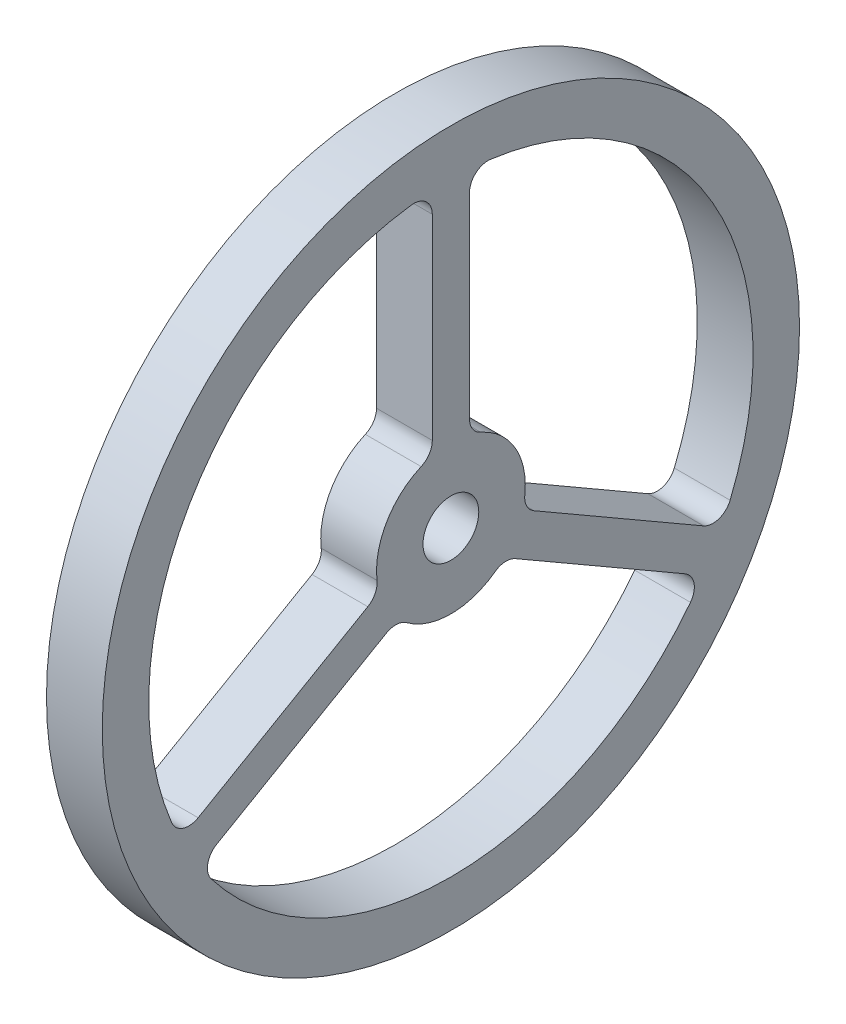
ISO-10303-21;
HEADER;
FILE_DESCRIPTION(('STEP AP214'),'2;1');
FILE_NAME('part.step','',(''),(''),'','','');
FILE_SCHEMA(('AUTOMOTIVE_DESIGN { 1 0 10303 214 1 1 1 1 }'));
ENDSEC;
DATA;
#1=APPLICATION_CONTEXT('core data for automotive mechanical design processes');
#2=APPLICATION_PROTOCOL_DEFINITION('international standard','automotive_design',2000,#1);
#3=PRODUCT_CONTEXT('',#1,'mechanical');
#4=PRODUCT('Part','Part','',(#3));
#5=PRODUCT_RELATED_PRODUCT_CATEGORY('part','',(#4));
#6=PRODUCT_DEFINITION_FORMATION('','',#4);
#7=PRODUCT_DEFINITION_CONTEXT('part definition',#1,'design');
#8=PRODUCT_DEFINITION('design','',#6,#7);
#9=PRODUCT_DEFINITION_SHAPE('','',#8);
#10=(LENGTH_UNIT() NAMED_UNIT(*) SI_UNIT(.MILLI.,.METRE.));
#11=(NAMED_UNIT(*) PLANE_ANGLE_UNIT() SI_UNIT($,.RADIAN.));
#12=(NAMED_UNIT(*) SI_UNIT($,.STERADIAN.) SOLID_ANGLE_UNIT());
#13=UNCERTAINTY_MEASURE_WITH_UNIT(LENGTH_MEASURE(1.E-05),#10,'distance_accuracy_value','');
#14=(GEOMETRIC_REPRESENTATION_CONTEXT(3) GLOBAL_UNCERTAINTY_ASSIGNED_CONTEXT((#13)) GLOBAL_UNIT_ASSIGNED_CONTEXT((#10,
#11,#12)) REPRESENTATION_CONTEXT('',''));
#15=CARTESIAN_POINT('',(0.,0.,0.));
#16=DIRECTION('',(0.,0.,1.));
#17=DIRECTION('',(1.,0.,0.));
#18=AXIS2_PLACEMENT_3D('',#15,#16,#17);
#19=CARTESIAN_POINT('',(6.,0.,2.));
#20=DIRECTION('',(0.,0.,-1.));
#21=DIRECTION('',(0.,1.,0.));
#22=AXIS2_PLACEMENT_3D('',#19,#20,#21);
#23=PLANE('',#22);
#24=DIRECTION('',(0.,-1.,0.));
#25=VECTOR('',#24,1.);
#26=CARTESIAN_POINT('',(0.,0.,2.));
#27=LINE('',#26,#25);
#28=CARTESIAN_POINT('',(0.,30.2365672654817,2.));
#29=VERTEX_POINT('',#28);
#30=CARTESIAN_POINT('',(0.,9.16515138991168,2.));
#31=VERTEX_POINT('',#30);
#32=EDGE_CURVE('E226',#29,#31,#27,.T.);
#33=ORIENTED_EDGE('',*,*,#32,.T.);
#34=DIRECTION('',(1.,0.,0.));
#35=VECTOR('',#34,1.);
#36=CARTESIAN_POINT('',(6.,9.16515138991168,2.));
#37=LINE('',#36,#35);
#38=CARTESIAN_POINT('',(6.,9.16515138991168,2.));
#39=VERTEX_POINT('',#38);
#40=EDGE_CURVE('E202',#31,#39,#37,.T.);
#41=ORIENTED_EDGE('',*,*,#40,.T.);
#42=DIRECTION('',(0.,-1.,0.));
#43=VECTOR('',#42,1.);
#44=CARTESIAN_POINT('',(6.,0.,2.));
#45=LINE('',#44,#43);
#46=CARTESIAN_POINT('',(6.,30.2365672654817,2.));
#47=VERTEX_POINT('',#46);
#48=EDGE_CURVE('E364',#47,#39,#45,.T.);
#49=ORIENTED_EDGE('',*,*,#48,.F.);
#50=DIRECTION('',(-1.,0.,0.));
#51=VECTOR('',#50,1.);
#52=CARTESIAN_POINT('',(6.,30.2365672654817,2.));
#53=LINE('',#52,#51);
#54=EDGE_CURVE('E218',#47,#29,#53,.T.);
#55=ORIENTED_EDGE('',*,*,#54,.T.);
#56=EDGE_LOOP('',(#33,#41,#49,#55));
#57=FACE_BOUND('',#56,.T.);
#58=ADVANCED_FACE('F35',(#57),#23,.F.);
#59=CARTESIAN_POINT('',(6.,0.,0.));
#60=DIRECTION('',(-1.,0.,0.));
#61=DIRECTION('',(0.,0.,1.));
#62=AXIS2_PLACEMENT_3D('',#59,#60,#61);
#63=CYLINDRICAL_SURFACE('',#62,8.);
#64=CARTESIAN_POINT('',(6.,0.,0.));
#65=DIRECTION('',(1.,0.,0.));
#66=DIRECTION('',(0.,0.,-1.));
#67=AXIS2_PLACEMENT_3D('',#64,#65,#66);
#68=CIRCLE('',#67,8.);
#69=CARTESIAN_POINT('',(6.,7.33212111192934,3.2));
#70=VERTEX_POINT('',#69);
#71=CARTESIAN_POINT('',(6.,-0.894779263856105,7.94980314655483));
#72=VERTEX_POINT('',#71);
#73=EDGE_CURVE('E217',#70,#72,#68,.T.);
#74=ORIENTED_EDGE('',*,*,#73,.F.);
#75=DIRECTION('',(-1.,0.,0.));
#76=VECTOR('',#75,1.);
#77=CARTESIAN_POINT('',(6.,7.33212111192935,3.2));
#78=LINE('',#77,#76);
#79=CARTESIAN_POINT('',(0.,7.33212111192934,3.2));
#80=VERTEX_POINT('',#79);
#81=EDGE_CURVE('E201',#70,#80,#78,.T.);
#82=ORIENTED_EDGE('',*,*,#81,.T.);
#83=CARTESIAN_POINT('',(0.,0.,0.));
#84=DIRECTION('',(1.,0.,0.));
#85=DIRECTION('',(0.,0.,-1.));
#86=AXIS2_PLACEMENT_3D('',#83,#84,#85);
#87=CIRCLE('',#86,8.);
#88=CARTESIAN_POINT('',(0.,-0.894779263856105,7.94980314655483));
#89=VERTEX_POINT('',#88);
#90=EDGE_CURVE('E214',#80,#89,#87,.T.);
#91=ORIENTED_EDGE('',*,*,#90,.T.);
#92=DIRECTION('',(-1.,0.,0.));
#93=VECTOR('',#92,1.);
#94=CARTESIAN_POINT('',(6.,-0.894779263856105,7.94980314655483));
#95=LINE('',#94,#93);
#96=EDGE_CURVE('E219',#89,#72,#95,.F.);
#97=ORIENTED_EDGE('',*,*,#96,.T.);
#98=EDGE_LOOP('',(#74,#82,#91,#97));
#99=FACE_BOUND('',#98,.T.);
#100=ADVANCED_FACE('F213',(#99),#63,.T.);
#101=CARTESIAN_POINT('',(6.,1.73205080756725,0.99999999999906));
#102=DIRECTION('',(0.,0.866025403784438,0.5));
#103=DIRECTION('',(0.,-0.5,0.866025403784439));
#104=AXIS2_PLACEMENT_3D('',#101,#102,#103);
#105=PLANE('',#104);
#106=DIRECTION('',(0.,0.5,-0.866025403784438));
#107=VECTOR('',#106,1.);
#108=CARTESIAN_POINT('',(6.,1.73205080756725,0.99999999999906));
#109=LINE('',#108,#107);
#110=CARTESIAN_POINT('',(6.,-13.3862328251737,27.1856353751434));
#111=VERTEX_POINT('',#110);
#112=CARTESIAN_POINT('',(6.,-2.85052488738901,8.93725393319354));
#113=VERTEX_POINT('',#112);
#114=EDGE_CURVE('E369',#111,#113,#109,.T.);
#115=ORIENTED_EDGE('',*,*,#114,.T.);
#116=DIRECTION('',(-1.,0.,0.));
#117=VECTOR('',#116,1.);
#118=CARTESIAN_POINT('',(6.,-2.85052488738901,8.93725393319354));
#119=LINE('',#118,#117);
#120=CARTESIAN_POINT('',(0.,-2.85052488738901,8.93725393319354));
#121=VERTEX_POINT('',#120);
#122=EDGE_CURVE('E272',#113,#121,#119,.T.);
#123=ORIENTED_EDGE('',*,*,#122,.T.);
#124=DIRECTION('',(0.,0.5,-0.866025403784438));
#125=VECTOR('',#124,1.);
#126=CARTESIAN_POINT('',(0.,1.73205080756725,0.99999999999906));
#127=LINE('',#126,#125);
#128=CARTESIAN_POINT('',(0.,-13.3862328251737,27.1856353751434));
#129=VERTEX_POINT('',#128);
#130=EDGE_CURVE('E225',#129,#121,#127,.T.);
#131=ORIENTED_EDGE('',*,*,#130,.F.);
#132=DIRECTION('',(1.,0.,0.));
#133=VECTOR('',#132,1.);
#134=CARTESIAN_POINT('',(6.,-13.3862328251737,27.1856353751434));
#135=LINE('',#134,#133);
#136=EDGE_CURVE('E270',#129,#111,#135,.T.);
#137=ORIENTED_EDGE('',*,*,#136,.T.);
#138=EDGE_LOOP('',(#115,#123,#131,#137));
#139=FACE_BOUND('',#138,.T.);
#140=ADVANCED_FACE('F427',(#139),#105,.T.);
#141=CARTESIAN_POINT('',(6.,-1.7320508075705,-1.00000000000094));
#142=DIRECTION('',(0.,0.866025403784438,0.500000000000001));
#143=DIRECTION('',(0.,-0.500000000000001,0.866025403784438));
#144=AXIS2_PLACEMENT_3D('',#141,#142,#143);
#145=PLANE('',#144);
#146=DIRECTION('',(0.,0.5,-0.866025403784438));
#147=VECTOR('',#146,1.);
#148=CARTESIAN_POINT('',(0.,-1.7320508075705,-1.00000000000094));
#149=LINE('',#148,#147);
#150=CARTESIAN_POINT('',(0.,-16.8503344403113,25.185635375143));
#151=VERTEX_POINT('',#150);
#152=CARTESIAN_POINT('',(0.,-6.31462650252594,6.93725393319212));
#153=VERTEX_POINT('',#152);
#154=EDGE_CURVE('E241',#151,#153,#149,.T.);
#155=ORIENTED_EDGE('',*,*,#154,.T.);
#156=DIRECTION('',(1.,0.,0.));
#157=VECTOR('',#156,1.);
#158=CARTESIAN_POINT('',(6.,-6.31462650252594,6.93725393319212));
#159=LINE('',#158,#157);
#160=CARTESIAN_POINT('',(6.,-6.31462650252594,6.93725393319212));
#161=VERTEX_POINT('',#160);
#162=EDGE_CURVE('E281',#153,#161,#159,.T.);
#163=ORIENTED_EDGE('',*,*,#162,.T.);
#164=DIRECTION('',(0.,0.5,-0.866025403784438));
#165=VECTOR('',#164,1.);
#166=CARTESIAN_POINT('',(6.,-1.7320508075705,-1.00000000000094));
#167=LINE('',#166,#165);
#168=CARTESIAN_POINT('',(6.,-16.8503344403113,25.185635375143));
#169=VERTEX_POINT('',#168);
#170=EDGE_CURVE('E414',#169,#161,#167,.T.);
#171=ORIENTED_EDGE('',*,*,#170,.F.);
#172=DIRECTION('',(-1.,0.,0.));
#173=VECTOR('',#172,1.);
#174=CARTESIAN_POINT('',(6.,-16.8503344403113,25.185635375143));
#175=LINE('',#174,#173);
#176=EDGE_CURVE('E279',#169,#151,#175,.T.);
#177=ORIENTED_EDGE('',*,*,#176,.T.);
#178=EDGE_LOOP('',(#155,#163,#171,#177));
#179=FACE_BOUND('',#178,.T.);
#180=ADVANCED_FACE('F456',(#179),#145,.F.);
#181=CARTESIAN_POINT('',(6.,-6.43734184807585,4.7498031465537));
#182=VERTEX_POINT('',#181);
#183=CARTESIAN_POINT('',(6.,-6.43734184807336,-4.74980314655707));
#184=VERTEX_POINT('',#183);
#185=EDGE_CURVE('E372',#182,#184,#68,.T.);
#186=ORIENTED_EDGE('',*,*,#185,.F.);
#187=DIRECTION('',(-1.,0.,0.));
#188=VECTOR('',#187,1.);
#189=CARTESIAN_POINT('',(6.,-6.43734184807585,4.7498031465537));
#190=LINE('',#189,#188);
#191=CARTESIAN_POINT('',(0.,-6.43734184807585,4.7498031465537));
#192=VERTEX_POINT('',#191);
#193=EDGE_CURVE('E277',#182,#192,#190,.T.);
#194=ORIENTED_EDGE('',*,*,#193,.T.);
#195=CARTESIAN_POINT('',(0.,-6.43734184807336,-4.74980314655707));
#196=VERTEX_POINT('',#195);
#197=EDGE_CURVE('E229',#192,#196,#87,.T.);
#198=ORIENTED_EDGE('',*,*,#197,.T.);
#199=DIRECTION('',(-1.,0.,0.));
#200=VECTOR('',#199,1.);
#201=CARTESIAN_POINT('',(6.,-6.43734184807336,-4.74980314655707));
#202=LINE('',#201,#200);
#203=EDGE_CURVE('E275',#196,#184,#202,.F.);
#204=ORIENTED_EDGE('',*,*,#203,.T.);
#205=EDGE_LOOP('',(#186,#194,#198,#204));
#206=FACE_BOUND('',#205,.T.);
#207=ADVANCED_FACE('F449',(#206),#63,.T.);
#208=CARTESIAN_POINT('',(6.,-1.73205080756635,0.999999999998538));
#209=DIRECTION('',(0.,-0.866025403784439,0.5));
#210=DIRECTION('',(0.,-0.5,-0.866025403784439));
#211=AXIS2_PLACEMENT_3D('',#208,#209,#210);
#212=PLANE('',#211);
#213=DIRECTION('',(0.,0.5,0.866025403784439));
#214=VECTOR('',#213,1.);
#215=CARTESIAN_POINT('',(6.,-1.73205080756635,0.999999999998538));
#216=LINE('',#215,#214);
#217=CARTESIAN_POINT('',(6.,-16.8503344403074,-25.1856353751459));
#218=VERTEX_POINT('',#217);
#219=CARTESIAN_POINT('',(6.,-6.31462650252282,-6.93725393319634));
#220=VERTEX_POINT('',#219);
#221=EDGE_CURVE('E374',#218,#220,#216,.T.);
#222=ORIENTED_EDGE('',*,*,#221,.T.);
#223=DIRECTION('',(-1.,0.,0.));
#224=VECTOR('',#223,1.);
#225=CARTESIAN_POINT('',(6.,-6.31462650252282,-6.93725393319634));
#226=LINE('',#225,#224);
#227=CARTESIAN_POINT('',(0.,-6.31462650252282,-6.93725393319634));
#228=VERTEX_POINT('',#227);
#229=EDGE_CURVE('E285',#220,#228,#226,.T.);
#230=ORIENTED_EDGE('',*,*,#229,.T.);
#231=DIRECTION('',(0.,0.5,0.866025403784439));
#232=VECTOR('',#231,1.);
#233=CARTESIAN_POINT('',(0.,-1.73205080756635,0.999999999998538));
#234=LINE('',#233,#232);
#235=CARTESIAN_POINT('',(0.,-16.8503344403074,-25.1856353751459));
#236=VERTEX_POINT('',#235);
#237=EDGE_CURVE('E240',#236,#228,#234,.T.);
#238=ORIENTED_EDGE('',*,*,#237,.F.);
#239=DIRECTION('',(1.,0.,0.));
#240=VECTOR('',#239,1.);
#241=CARTESIAN_POINT('',(6.,-16.8503344403074,-25.1856353751459));
#242=LINE('',#241,#240);
#243=EDGE_CURVE('E283',#236,#218,#242,.T.);
#244=ORIENTED_EDGE('',*,*,#243,.T.);
#245=EDGE_LOOP('',(#222,#230,#238,#244));
#246=FACE_BOUND('',#245,.T.);
#247=ADVANCED_FACE('F452',(#246),#212,.T.);
#248=CARTESIAN_POINT('',(6.,1.7320508075714,-1.00000000000145));
#249=DIRECTION('',(0.,-0.866025403784439,0.5));
#250=DIRECTION('',(0.,-0.5,-0.866025403784439));
#251=AXIS2_PLACEMENT_3D('',#248,#249,#250);
#252=PLANE('',#251);
#253=DIRECTION('',(0.,0.5,0.866025403784439));
#254=VECTOR('',#253,1.);
#255=CARTESIAN_POINT('',(0.,1.7320508075714,-1.00000000000145));
#256=LINE('',#255,#254);
#257=CARTESIAN_POINT('',(0.,-13.3862328251693,-27.1856353751453));
#258=VERTEX_POINT('',#257);
#259=CARTESIAN_POINT('',(0.,-2.8505248873838,-8.93725393319413));
#260=VERTEX_POINT('',#259);
#261=EDGE_CURVE('E238',#258,#260,#256,.T.);
#262=ORIENTED_EDGE('',*,*,#261,.T.);
#263=DIRECTION('',(1.,0.,0.));
#264=VECTOR('',#263,1.);
#265=CARTESIAN_POINT('',(6.,-2.8505248873838,-8.93725393319413));
#266=LINE('',#265,#264);
#267=CARTESIAN_POINT('',(6.,-2.8505248873838,-8.93725393319413));
#268=VERTEX_POINT('',#267);
#269=EDGE_CURVE('E296',#260,#268,#266,.T.);
#270=ORIENTED_EDGE('',*,*,#269,.T.);
#271=DIRECTION('',(0.,0.5,0.866025403784439));
#272=VECTOR('',#271,1.);
#273=CARTESIAN_POINT('',(6.,1.7320508075714,-1.00000000000145));
#274=LINE('',#273,#272);
#275=CARTESIAN_POINT('',(6.,-13.3862328251693,-27.1856353751453));
#276=VERTEX_POINT('',#275);
#277=EDGE_CURVE('E264',#276,#268,#274,.T.);
#278=ORIENTED_EDGE('',*,*,#277,.F.);
#279=DIRECTION('',(-1.,0.,0.));
#280=VECTOR('',#279,1.);
#281=CARTESIAN_POINT('',(6.,-13.3862328251693,-27.1856353751453));
#282=LINE('',#281,#280);
#283=EDGE_CURVE('E293',#276,#258,#282,.T.);
#284=ORIENTED_EDGE('',*,*,#283,.T.);
#285=EDGE_LOOP('',(#262,#270,#278,#284));
#286=FACE_BOUND('',#285,.T.);
#287=ADVANCED_FACE('F390',(#286),#252,.F.);
#288=CARTESIAN_POINT('',(6.,-0.894779263851941,-7.9498031465553));
#289=VERTEX_POINT('',#288);
#290=CARTESIAN_POINT('',(6.,7.33212111192934,-3.2));
#291=VERTEX_POINT('',#290);
#292=EDGE_CURVE('E371',#289,#291,#68,.T.);
#293=ORIENTED_EDGE('',*,*,#292,.F.);
#294=DIRECTION('',(-1.,0.,0.));
#295=VECTOR('',#294,1.);
#296=CARTESIAN_POINT('',(6.,-0.894779263851941,-7.9498031465553));
#297=LINE('',#296,#295);
#298=CARTESIAN_POINT('',(0.,-0.894779263851941,-7.9498031465553));
#299=VERTEX_POINT('',#298);
#300=EDGE_CURVE('E290',#289,#299,#297,.T.);
#301=ORIENTED_EDGE('',*,*,#300,.T.);
#302=CARTESIAN_POINT('',(0.,7.33212111192934,-3.2));
#303=VERTEX_POINT('',#302);
#304=EDGE_CURVE('E228',#299,#303,#87,.T.);
#305=ORIENTED_EDGE('',*,*,#304,.T.);
#306=DIRECTION('',(-1.,0.,0.));
#307=VECTOR('',#306,1.);
#308=CARTESIAN_POINT('',(6.,7.33212111192935,-3.2));
#309=LINE('',#308,#307);
#310=EDGE_CURVE('E288',#303,#291,#309,.F.);
#311=ORIENTED_EDGE('',*,*,#310,.T.);
#312=EDGE_LOOP('',(#293,#301,#305,#311));
#313=FACE_BOUND('',#312,.T.);
#314=ADVANCED_FACE('F406',(#313),#63,.T.);
#315=CARTESIAN_POINT('',(6.,0.,-2.));
#316=DIRECTION('',(0.,0.,-1.));
#317=DIRECTION('',(0.,1.,0.));
#318=AXIS2_PLACEMENT_3D('',#315,#316,#317);
#319=PLANE('',#318);
#320=DIRECTION('',(0.,-1.,0.));
#321=VECTOR('',#320,1.);
#322=CARTESIAN_POINT('',(6.,0.,-2.));
#323=LINE('',#322,#321);
#324=CARTESIAN_POINT('',(6.,30.2365672654817,-2.));
#325=VERTEX_POINT('',#324);
#326=CARTESIAN_POINT('',(6.,9.16515138991168,-2.));
#327=VERTEX_POINT('',#326);
#328=EDGE_CURVE('E409',#325,#327,#323,.T.);
#329=ORIENTED_EDGE('',*,*,#328,.T.);
#330=DIRECTION('',(-1.,0.,0.));
#331=VECTOR('',#330,1.);
#332=CARTESIAN_POINT('',(6.,9.16515138991168,-2.));
#333=LINE('',#332,#331);
#334=CARTESIAN_POINT('',(0.,9.16515138991168,-2.));
#335=VERTEX_POINT('',#334);
#336=EDGE_CURVE('E300',#327,#335,#333,.T.);
#337=ORIENTED_EDGE('',*,*,#336,.T.);
#338=DIRECTION('',(0.,-1.,0.));
#339=VECTOR('',#338,1.);
#340=CARTESIAN_POINT('',(0.,0.,-2.));
#341=LINE('',#340,#339);
#342=CARTESIAN_POINT('',(0.,30.2365672654817,-2.));
#343=VERTEX_POINT('',#342);
#344=EDGE_CURVE('E237',#343,#335,#341,.T.);
#345=ORIENTED_EDGE('',*,*,#344,.F.);
#346=DIRECTION('',(1.,0.,0.));
#347=VECTOR('',#346,1.);
#348=CARTESIAN_POINT('',(6.,30.2365672654817,-2.));
#349=LINE('',#348,#347);
#350=EDGE_CURVE('E298',#343,#325,#349,.T.);
#351=ORIENTED_EDGE('',*,*,#350,.T.);
#352=EDGE_LOOP('',(#329,#337,#345,#351));
#353=FACE_BOUND('',#352,.T.);
#354=ADVANCED_FACE('F459',(#353),#319,.T.);
#355=CARTESIAN_POINT('',(6.,0.,0.));
#356=DIRECTION('',(-1.,0.,0.));
#357=DIRECTION('',(0.,0.,1.));
#358=AXIS2_PLACEMENT_3D('',#355,#356,#357);
#359=CYLINDRICAL_SURFACE('',#358,37.5);
#360=CARTESIAN_POINT('',(6.,0.,0.));
#361=DIRECTION('',(1.,0.,0.));
#362=DIRECTION('',(0.,0.,-1.));
#363=AXIS2_PLACEMENT_3D('',#360,#361,#362);
#364=CIRCLE('',#363,37.5);
#365=CARTESIAN_POINT('',(6.,0.,-37.5));
#366=VERTEX_POINT('',#365);
#367=EDGE_CURVE('E382',#366,#366,#364,.T.);
#368=ORIENTED_EDGE('',*,*,#367,.F.);
#369=EDGE_LOOP('',(#368));
#370=FACE_BOUND('',#369,.T.);
#371=CARTESIAN_POINT('',(0.,0.,0.));
#372=DIRECTION('',(1.,0.,0.));
#373=DIRECTION('',(0.,0.,-1.));
#374=AXIS2_PLACEMENT_3D('',#371,#372,#373);
#375=CIRCLE('',#374,37.5);
#376=CARTESIAN_POINT('',(0.,0.,-37.5));
#377=VERTEX_POINT('',#376);
#378=EDGE_CURVE('E258',#377,#377,#375,.T.);
#379=ORIENTED_EDGE('',*,*,#378,.T.);
#380=EDGE_LOOP('',(#379));
#381=FACE_BOUND('',#380,.T.);
#382=ADVANCED_FACE('F462',(#370,#381),#359,.T.);
#383=CARTESIAN_POINT('',(6.,0.,0.));
#384=DIRECTION('',(-1.,0.,0.));
#385=DIRECTION('',(0.,0.,1.));
#386=AXIS2_PLACEMENT_3D('',#383,#384,#385);
#387=CYLINDRICAL_SURFACE('',#386,32.5);
#388=CARTESIAN_POINT('',(6.,0.,0.));
#389=DIRECTION('',(1.,0.,0.));
#390=DIRECTION('',(0.,0.,-1.));
#391=AXIS2_PLACEMENT_3D('',#388,#389,#390);
#392=CIRCLE('',#391,32.5);
#393=CARTESIAN_POINT('',(6.,32.2192929878084,4.26229508196721));
#394=VERTEX_POINT('',#393);
#395=CARTESIAN_POINT('',(6.,-12.418390674497,30.0338737603987));
#396=VERTEX_POINT('',#395);
#397=EDGE_CURVE('E365',#394,#396,#392,.T.);
#398=ORIENTED_EDGE('',*,*,#397,.T.);
#399=DIRECTION('',(-1.,0.,0.));
#400=VECTOR('',#399,1.);
#401=CARTESIAN_POINT('',(6.,-12.418390674497,30.0338737603987));
#402=LINE('',#401,#400);
#403=CARTESIAN_POINT('',(0.,-12.418390674497,30.0338737603987));
#404=VERTEX_POINT('',#403);
#405=EDGE_CURVE('E208',#396,#404,#402,.T.);
#406=ORIENTED_EDGE('',*,*,#405,.T.);
#407=CARTESIAN_POINT('',(0.,0.,0.));
#408=DIRECTION('',(1.,0.,0.));
#409=DIRECTION('',(0.,0.,-1.));
#410=AXIS2_PLACEMENT_3D('',#407,#408,#409);
#411=CIRCLE('',#410,32.5);
#412=CARTESIAN_POINT('',(0.,32.2192929878084,4.26229508196721));
#413=VERTEX_POINT('',#412);
#414=EDGE_CURVE('E230',#413,#404,#411,.T.);
#415=ORIENTED_EDGE('',*,*,#414,.F.);
#416=DIRECTION('',(-1.,0.,0.));
#417=VECTOR('',#416,1.);
#418=CARTESIAN_POINT('',(6.,32.2192929878084,4.26229508196721));
#419=LINE('',#418,#417);
#420=EDGE_CURVE('E57',#413,#394,#419,.F.);
#421=ORIENTED_EDGE('',*,*,#420,.T.);
#422=EDGE_LOOP('',(#398,#406,#415,#421));
#423=FACE_BOUND('',#422,.T.);
#424=ADVANCED_FACE('F357',(#423),#387,.F.);
#425=CARTESIAN_POINT('',(6.,-19.8009023133149,25.771578678431));
#426=VERTEX_POINT('',#425);
#427=CARTESIAN_POINT('',(6.,-19.8009023133108,-25.7715786784342));
#428=VERTEX_POINT('',#427);
#429=EDGE_CURVE('E367',#426,#428,#392,.T.);
#430=ORIENTED_EDGE('',*,*,#429,.T.);
#431=DIRECTION('',(-1.,0.,0.));
#432=VECTOR('',#431,1.);
#433=CARTESIAN_POINT('',(6.,-19.8009023133108,-25.7715786784342));
#434=LINE('',#433,#432);
#435=CARTESIAN_POINT('',(0.,-19.8009023133108,-25.7715786784342));
#436=VERTEX_POINT('',#435);
#437=EDGE_CURVE('E305',#428,#436,#434,.T.);
#438=ORIENTED_EDGE('',*,*,#437,.T.);
#439=CARTESIAN_POINT('',(0.,-19.8009023133149,25.771578678431));
#440=VERTEX_POINT('',#439);
#441=EDGE_CURVE('E232',#440,#436,#411,.T.);
#442=ORIENTED_EDGE('',*,*,#441,.F.);
#443=DIRECTION('',(-1.,0.,0.));
#444=VECTOR('',#443,1.);
#445=CARTESIAN_POINT('',(6.,-19.8009023133149,25.771578678431));
#446=LINE('',#445,#444);
#447=EDGE_CURVE('E303',#440,#426,#446,.F.);
#448=ORIENTED_EDGE('',*,*,#447,.T.);
#449=EDGE_LOOP('',(#430,#438,#442,#448));
#450=FACE_BOUND('',#449,.T.);
#451=ADVANCED_FACE('F488',(#450),#387,.F.);
#452=CARTESIAN_POINT('',(0.,-12.4183906744922,-30.0338737604007));
#453=VERTEX_POINT('',#452);
#454=CARTESIAN_POINT('',(0.,32.2192929878084,-4.26229508196721));
#455=VERTEX_POINT('',#454);
#456=EDGE_CURVE('E249',#453,#455,#411,.T.);
#457=ORIENTED_EDGE('',*,*,#456,.F.);
#458=DIRECTION('',(-1.,0.,0.));
#459=VECTOR('',#458,1.);
#460=CARTESIAN_POINT('',(6.,-12.4183906744922,-30.0338737604007));
#461=LINE('',#460,#459);
#462=CARTESIAN_POINT('',(6.,-12.4183906744922,-30.0338737604007));
#463=VERTEX_POINT('',#462);
#464=EDGE_CURVE('E311',#453,#463,#461,.F.);
#465=ORIENTED_EDGE('',*,*,#464,.T.);
#466=CARTESIAN_POINT('',(6.,32.2192929878084,-4.26229508196721));
#467=VERTEX_POINT('',#466);
#468=EDGE_CURVE('E376',#463,#467,#392,.T.);
#469=ORIENTED_EDGE('',*,*,#468,.T.);
#470=DIRECTION('',(-1.,0.,0.));
#471=VECTOR('',#470,1.);
#472=CARTESIAN_POINT('',(6.,32.2192929878084,-4.26229508196721));
#473=LINE('',#472,#471);
#474=EDGE_CURVE('E308',#467,#455,#473,.T.);
#475=ORIENTED_EDGE('',*,*,#474,.T.);
#476=EDGE_LOOP('',(#457,#465,#469,#475));
#477=FACE_BOUND('',#476,.T.);
#478=ADVANCED_FACE('F518',(#477),#387,.F.);
#479=CARTESIAN_POINT('',(6.,0.,0.));
#480=DIRECTION('',(-1.,0.,0.));
#481=DIRECTION('',(0.,0.,1.));
#482=AXIS2_PLACEMENT_3D('',#479,#480,#481);
#483=CYLINDRICAL_SURFACE('',#482,3.);
#484=CARTESIAN_POINT('',(6.,0.,0.));
#485=DIRECTION('',(1.,0.,0.));
#486=DIRECTION('',(0.,0.,-1.));
#487=AXIS2_PLACEMENT_3D('',#484,#485,#486);
#488=CIRCLE('',#487,3.);
#489=CARTESIAN_POINT('',(6.,0.,-3.));
#490=VERTEX_POINT('',#489);
#491=EDGE_CURVE('E265',#490,#490,#488,.T.);
#492=ORIENTED_EDGE('',*,*,#491,.T.);
#493=EDGE_LOOP('',(#492));
#494=FACE_BOUND('',#493,.T.);
#495=CARTESIAN_POINT('',(0.,0.,0.));
#496=DIRECTION('',(1.,0.,0.));
#497=DIRECTION('',(0.,0.,-1.));
#498=AXIS2_PLACEMENT_3D('',#495,#496,#497);
#499=CIRCLE('',#498,3.);
#500=CARTESIAN_POINT('',(0.,0.,-3.));
#501=VERTEX_POINT('',#500);
#502=EDGE_CURVE('E261',#501,#501,#499,.T.);
#503=ORIENTED_EDGE('',*,*,#502,.F.);
#504=EDGE_LOOP('',(#503));
#505=FACE_BOUND('',#504,.T.);
#506=ADVANCED_FACE('F614',(#494,#505),#483,.F.);
#507=CARTESIAN_POINT('',(6.,0.,0.));
#508=DIRECTION('',(1.,0.,0.));
#509=DIRECTION('',(0.,0.,-1.));
#510=AXIS2_PLACEMENT_3D('',#507,#508,#509);
#511=PLANE('',#510);
#512=ORIENTED_EDGE('',*,*,#468,.F.);
#513=CARTESIAN_POINT('',(6.,-11.6541820176004,-28.1856353751453));
#514=DIRECTION('',(1.,0.,0.));
#515=DIRECTION('',(0.,0.,-1.));
#516=AXIS2_PLACEMENT_3D('',#513,#514,#515);
#517=CIRCLE('',#516,2.);
#518=EDGE_CURVE('E342',#463,#276,#517,.F.);
#519=ORIENTED_EDGE('',*,*,#518,.T.);
#520=ORIENTED_EDGE('',*,*,#277,.T.);
#521=CARTESIAN_POINT('',(6.,-1.11847407981493,-9.93725393319413));
#522=DIRECTION('',(1.,0.,0.));
#523=DIRECTION('',(0.,0.,-1.));
#524=AXIS2_PLACEMENT_3D('',#521,#522,#523);
#525=CIRCLE('',#524,2.);
#526=EDGE_CURVE('E330',#268,#289,#525,.F.);
#527=ORIENTED_EDGE('',*,*,#526,.T.);
#528=ORIENTED_EDGE('',*,*,#292,.T.);
#529=CARTESIAN_POINT('',(6.,9.16515138991168,-4.));
#530=DIRECTION('',(1.,0.,0.));
#531=DIRECTION('',(0.,0.,-1.));
#532=AXIS2_PLACEMENT_3D('',#529,#530,#531);
#533=CIRCLE('',#532,2.);
#534=EDGE_CURVE('E334',#291,#327,#533,.F.);
#535=ORIENTED_EDGE('',*,*,#534,.T.);
#536=ORIENTED_EDGE('',*,*,#328,.F.);
#537=CARTESIAN_POINT('',(6.,30.2365672654817,-4.));
#538=DIRECTION('',(1.,0.,0.));
#539=DIRECTION('',(0.,0.,-1.));
#540=AXIS2_PLACEMENT_3D('',#537,#538,#539);
#541=CIRCLE('',#540,2.);
#542=EDGE_CURVE('E353',#325,#467,#541,.F.);
#543=ORIENTED_EDGE('',*,*,#542,.T.);
#544=EDGE_LOOP('',(#512,#519,#520,#527,#528,#535,#536,#543));
#545=FACE_BOUND('',#544,.T.);
#546=ORIENTED_EDGE('',*,*,#429,.F.);
#547=CARTESIAN_POINT('',(6.,-18.5823852478801,24.185635375143));
#548=DIRECTION('',(1.,0.,0.));
#549=DIRECTION('',(0.,0.,-1.));
#550=AXIS2_PLACEMENT_3D('',#547,#548,#549);
#551=CIRCLE('',#550,2.);
#552=EDGE_CURVE('E346',#426,#169,#551,.F.);
#553=ORIENTED_EDGE('',*,*,#552,.T.);
#554=ORIENTED_EDGE('',*,*,#170,.T.);
#555=CARTESIAN_POINT('',(6.,-8.04667731009481,5.93725393319212));
#556=DIRECTION('',(1.,0.,0.));
#557=DIRECTION('',(0.,0.,-1.));
#558=AXIS2_PLACEMENT_3D('',#555,#556,#557);
#559=CIRCLE('',#558,2.);
#560=EDGE_CURVE('E322',#161,#182,#559,.F.);
#561=ORIENTED_EDGE('',*,*,#560,.T.);
#562=ORIENTED_EDGE('',*,*,#185,.T.);
#563=CARTESIAN_POINT('',(6.,-8.0466773100917,-5.93725393319634));
#564=DIRECTION('',(1.,0.,0.));
#565=DIRECTION('',(0.,0.,-1.));
#566=AXIS2_PLACEMENT_3D('',#563,#564,#565);
#567=CIRCLE('',#566,2.);
#568=EDGE_CURVE('E326',#184,#220,#567,.F.);
#569=ORIENTED_EDGE('',*,*,#568,.T.);
#570=ORIENTED_EDGE('',*,*,#221,.F.);
#571=CARTESIAN_POINT('',(6.,-18.5823852478763,-24.1856353751459));
#572=DIRECTION('',(1.,0.,0.));
#573=DIRECTION('',(0.,0.,-1.));
#574=AXIS2_PLACEMENT_3D('',#571,#572,#573);
#575=CIRCLE('',#574,2.);
#576=EDGE_CURVE('E338',#218,#428,#575,.F.);
#577=ORIENTED_EDGE('',*,*,#576,.T.);
#578=EDGE_LOOP('',(#546,#553,#554,#561,#562,#569,#570,#577));
#579=FACE_BOUND('',#578,.T.);
#580=ORIENTED_EDGE('',*,*,#397,.F.);
#581=CARTESIAN_POINT('',(6.,30.2365672654817,4.));
#582=DIRECTION('',(1.,0.,0.));
#583=DIRECTION('',(0.,0.,-1.));
#584=AXIS2_PLACEMENT_3D('',#581,#582,#583);
#585=CIRCLE('',#584,2.);
#586=EDGE_CURVE('E11',#394,#47,#585,.F.);
#587=ORIENTED_EDGE('',*,*,#586,.T.);
#588=ORIENTED_EDGE('',*,*,#48,.T.);
#589=CARTESIAN_POINT('',(6.,9.16515138991168,4.));
#590=DIRECTION('',(1.,0.,0.));
#591=DIRECTION('',(0.,0.,-1.));
#592=AXIS2_PLACEMENT_3D('',#589,#590,#591);
#593=CIRCLE('',#592,2.);
#594=EDGE_CURVE('E207',#39,#70,#593,.F.);
#595=ORIENTED_EDGE('',*,*,#594,.T.);
#596=ORIENTED_EDGE('',*,*,#73,.T.);
#597=CARTESIAN_POINT('',(6.,-1.11847407982013,9.93725393319354));
#598=DIRECTION('',(1.,0.,0.));
#599=DIRECTION('',(0.,0.,-1.));
#600=AXIS2_PLACEMENT_3D('',#597,#598,#599);
#601=CIRCLE('',#600,2.);
#602=EDGE_CURVE('E318',#72,#113,#601,.F.);
#603=ORIENTED_EDGE('',*,*,#602,.T.);
#604=ORIENTED_EDGE('',*,*,#114,.F.);
#605=CARTESIAN_POINT('',(6.,-11.6541820176049,28.1856353751434));
#606=DIRECTION('',(1.,0.,0.));
#607=DIRECTION('',(0.,0.,-1.));
#608=AXIS2_PLACEMENT_3D('',#605,#606,#607);
#609=CIRCLE('',#608,2.);
#610=EDGE_CURVE('E50',#111,#396,#609,.F.);
#611=ORIENTED_EDGE('',*,*,#610,.T.);
#612=EDGE_LOOP('',(#580,#587,#588,#595,#596,#603,#604,#611));
#613=FACE_BOUND('',#612,.T.);
#614=ORIENTED_EDGE('',*,*,#367,.T.);
#615=EDGE_LOOP('',(#614));
#616=FACE_BOUND('',#615,.T.);
#617=ORIENTED_EDGE('',*,*,#491,.F.);
#618=EDGE_LOOP('',(#617));
#619=FACE_BOUND('',#618,.T.);
#620=ADVANCED_FACE('F362',(#545,#579,#613,#616,#619),#511,.T.);
#621=CARTESIAN_POINT('',(0.,0.,0.));
#622=DIRECTION('',(1.,0.,0.));
#623=DIRECTION('',(0.,0.,-1.));
#624=AXIS2_PLACEMENT_3D('',#621,#622,#623);
#625=PLANE('',#624);
#626=ORIENTED_EDGE('',*,*,#261,.F.);
#627=CARTESIAN_POINT('',(0.,-11.6541820176004,-28.1856353751453));
#628=DIRECTION('',(1.,0.,0.));
#629=DIRECTION('',(0.,0.,-1.));
#630=AXIS2_PLACEMENT_3D('',#627,#628,#629);
#631=CIRCLE('',#630,2.);
#632=EDGE_CURVE('E340',#258,#453,#631,.T.);
#633=ORIENTED_EDGE('',*,*,#632,.T.);
#634=ORIENTED_EDGE('',*,*,#456,.T.);
#635=CARTESIAN_POINT('',(0.,30.2365672654817,-4.));
#636=DIRECTION('',(1.,0.,0.));
#637=DIRECTION('',(0.,0.,-1.));
#638=AXIS2_PLACEMENT_3D('',#635,#636,#637);
#639=CIRCLE('',#638,2.);
#640=EDGE_CURVE('E351',#455,#343,#639,.T.);
#641=ORIENTED_EDGE('',*,*,#640,.T.);
#642=ORIENTED_EDGE('',*,*,#344,.T.);
#643=CARTESIAN_POINT('',(0.,9.16515138991168,-4.));
#644=DIRECTION('',(1.,0.,0.));
#645=DIRECTION('',(0.,0.,-1.));
#646=AXIS2_PLACEMENT_3D('',#643,#644,#645);
#647=CIRCLE('',#646,2.);
#648=EDGE_CURVE('E332',#335,#303,#647,.T.);
#649=ORIENTED_EDGE('',*,*,#648,.T.);
#650=ORIENTED_EDGE('',*,*,#304,.F.);
#651=CARTESIAN_POINT('',(0.,-1.11847407981493,-9.93725393319413));
#652=DIRECTION('',(1.,0.,0.));
#653=DIRECTION('',(0.,0.,-1.));
#654=AXIS2_PLACEMENT_3D('',#651,#652,#653);
#655=CIRCLE('',#654,2.);
#656=EDGE_CURVE('E328',#299,#260,#655,.T.);
#657=ORIENTED_EDGE('',*,*,#656,.T.);
#658=EDGE_LOOP('',(#626,#633,#634,#641,#642,#649,#650,#657));
#659=FACE_BOUND('',#658,.T.);
#660=ORIENTED_EDGE('',*,*,#154,.F.);
#661=CARTESIAN_POINT('',(0.,-18.5823852478801,24.185635375143));
#662=DIRECTION('',(1.,0.,0.));
#663=DIRECTION('',(0.,0.,-1.));
#664=AXIS2_PLACEMENT_3D('',#661,#662,#663);
#665=CIRCLE('',#664,2.);
#666=EDGE_CURVE('E344',#151,#440,#665,.T.);
#667=ORIENTED_EDGE('',*,*,#666,.T.);
#668=ORIENTED_EDGE('',*,*,#441,.T.);
#669=CARTESIAN_POINT('',(0.,-18.5823852478763,-24.1856353751459));
#670=DIRECTION('',(1.,0.,0.));
#671=DIRECTION('',(0.,0.,-1.));
#672=AXIS2_PLACEMENT_3D('',#669,#670,#671);
#673=CIRCLE('',#672,2.);
#674=EDGE_CURVE('E336',#436,#236,#673,.T.);
#675=ORIENTED_EDGE('',*,*,#674,.T.);
#676=ORIENTED_EDGE('',*,*,#237,.T.);
#677=CARTESIAN_POINT('',(0.,-8.0466773100917,-5.93725393319634));
#678=DIRECTION('',(1.,0.,0.));
#679=DIRECTION('',(0.,0.,-1.));
#680=AXIS2_PLACEMENT_3D('',#677,#678,#679);
#681=CIRCLE('',#680,2.);
#682=EDGE_CURVE('E324',#228,#196,#681,.T.);
#683=ORIENTED_EDGE('',*,*,#682,.T.);
#684=ORIENTED_EDGE('',*,*,#197,.F.);
#685=CARTESIAN_POINT('',(0.,-8.04667731009481,5.93725393319212));
#686=DIRECTION('',(1.,0.,0.));
#687=DIRECTION('',(0.,0.,-1.));
#688=AXIS2_PLACEMENT_3D('',#685,#686,#687);
#689=CIRCLE('',#688,2.);
#690=EDGE_CURVE('E320',#192,#153,#689,.T.);
#691=ORIENTED_EDGE('',*,*,#690,.T.);
#692=EDGE_LOOP('',(#660,#667,#668,#675,#676,#683,#684,#691));
#693=FACE_BOUND('',#692,.T.);
#694=ORIENTED_EDGE('',*,*,#32,.F.);
#695=CARTESIAN_POINT('',(0.,30.2365672654817,4.));
#696=DIRECTION('',(1.,0.,0.));
#697=DIRECTION('',(0.,0.,-1.));
#698=AXIS2_PLACEMENT_3D('',#695,#696,#697);
#699=CIRCLE('',#698,2.);
#700=EDGE_CURVE('E43',#29,#413,#699,.T.);
#701=ORIENTED_EDGE('',*,*,#700,.T.);
#702=ORIENTED_EDGE('',*,*,#414,.T.);
#703=CARTESIAN_POINT('',(0.,-11.6541820176049,28.1856353751434));
#704=DIRECTION('',(1.,0.,0.));
#705=DIRECTION('',(0.,0.,-1.));
#706=AXIS2_PLACEMENT_3D('',#703,#704,#705);
#707=CIRCLE('',#706,2.);
#708=EDGE_CURVE('E348',#404,#129,#707,.T.);
#709=ORIENTED_EDGE('',*,*,#708,.T.);
#710=ORIENTED_EDGE('',*,*,#130,.T.);
#711=CARTESIAN_POINT('',(0.,-1.11847407982013,9.93725393319354));
#712=DIRECTION('',(1.,0.,0.));
#713=DIRECTION('',(0.,0.,-1.));
#714=AXIS2_PLACEMENT_3D('',#711,#712,#713);
#715=CIRCLE('',#714,2.);
#716=EDGE_CURVE('E224',#121,#89,#715,.T.);
#717=ORIENTED_EDGE('',*,*,#716,.T.);
#718=ORIENTED_EDGE('',*,*,#90,.F.);
#719=CARTESIAN_POINT('',(0.,9.16515138991168,4.));
#720=DIRECTION('',(1.,0.,0.));
#721=DIRECTION('',(0.,0.,-1.));
#722=AXIS2_PLACEMENT_3D('',#719,#720,#721);
#723=CIRCLE('',#722,2.);
#724=EDGE_CURVE('E197',#80,#31,#723,.T.);
#725=ORIENTED_EDGE('',*,*,#724,.T.);
#726=EDGE_LOOP('',(#694,#701,#702,#709,#710,#717,#718,#725));
#727=FACE_BOUND('',#726,.T.);
#728=ORIENTED_EDGE('',*,*,#378,.F.);
#729=EDGE_LOOP('',(#728));
#730=FACE_BOUND('',#729,.T.);
#731=ORIENTED_EDGE('',*,*,#502,.T.);
#732=EDGE_LOOP('',(#731));
#733=FACE_BOUND('',#732,.T.);
#734=ADVANCED_FACE('F221',(#659,#693,#727,#730,#733),#625,.F.);
#735=CARTESIAN_POINT('',(6.,9.16515138991168,4.));
#736=DIRECTION('',(-1.,0.,0.));
#737=DIRECTION('',(0.,0.,1.));
#738=AXIS2_PLACEMENT_3D('',#735,#736,#737);
#739=CYLINDRICAL_SURFACE('',#738,2.);
#740=ORIENTED_EDGE('',*,*,#594,.F.);
#741=ORIENTED_EDGE('',*,*,#40,.F.);
#742=ORIENTED_EDGE('',*,*,#724,.F.);
#743=ORIENTED_EDGE('',*,*,#81,.F.);
#744=EDGE_LOOP('',(#740,#741,#742,#743));
#745=FACE_BOUND('',#744,.T.);
#746=ADVANCED_FACE('F200',(#745),#739,.F.);
#747=CARTESIAN_POINT('',(6.,-1.11847407982013,9.93725393319354));
#748=DIRECTION('',(-1.,0.,0.));
#749=DIRECTION('',(0.,0.,1.));
#750=AXIS2_PLACEMENT_3D('',#747,#748,#749);
#751=CYLINDRICAL_SURFACE('',#750,2.);
#752=ORIENTED_EDGE('',*,*,#602,.F.);
#753=ORIENTED_EDGE('',*,*,#96,.F.);
#754=ORIENTED_EDGE('',*,*,#716,.F.);
#755=ORIENTED_EDGE('',*,*,#122,.F.);
#756=EDGE_LOOP('',(#752,#753,#754,#755));
#757=FACE_BOUND('',#756,.T.);
#758=ADVANCED_FACE('F431',(#757),#751,.F.);
#759=CARTESIAN_POINT('',(6.,-8.04667731009481,5.93725393319212));
#760=DIRECTION('',(-1.,0.,0.));
#761=DIRECTION('',(0.,0.,1.));
#762=AXIS2_PLACEMENT_3D('',#759,#760,#761);
#763=CYLINDRICAL_SURFACE('',#762,2.);
#764=ORIENTED_EDGE('',*,*,#560,.F.);
#765=ORIENTED_EDGE('',*,*,#162,.F.);
#766=ORIENTED_EDGE('',*,*,#690,.F.);
#767=ORIENTED_EDGE('',*,*,#193,.F.);
#768=EDGE_LOOP('',(#764,#765,#766,#767));
#769=FACE_BOUND('',#768,.T.);
#770=ADVANCED_FACE('F433',(#769),#763,.F.);
#771=CARTESIAN_POINT('',(6.,-8.0466773100917,-5.93725393319634));
#772=DIRECTION('',(-1.,0.,0.));
#773=DIRECTION('',(0.,0.,1.));
#774=AXIS2_PLACEMENT_3D('',#771,#772,#773);
#775=CYLINDRICAL_SURFACE('',#774,2.);
#776=ORIENTED_EDGE('',*,*,#568,.F.);
#777=ORIENTED_EDGE('',*,*,#203,.F.);
#778=ORIENTED_EDGE('',*,*,#682,.F.);
#779=ORIENTED_EDGE('',*,*,#229,.F.);
#780=EDGE_LOOP('',(#776,#777,#778,#779));
#781=FACE_BOUND('',#780,.T.);
#782=ADVANCED_FACE('F439',(#781),#775,.F.);
#783=CARTESIAN_POINT('',(6.,-1.11847407981493,-9.93725393319413));
#784=DIRECTION('',(-1.,0.,0.));
#785=DIRECTION('',(0.,0.,1.));
#786=AXIS2_PLACEMENT_3D('',#783,#784,#785);
#787=CYLINDRICAL_SURFACE('',#786,2.);
#788=ORIENTED_EDGE('',*,*,#526,.F.);
#789=ORIENTED_EDGE('',*,*,#269,.F.);
#790=ORIENTED_EDGE('',*,*,#656,.F.);
#791=ORIENTED_EDGE('',*,*,#300,.F.);
#792=EDGE_LOOP('',(#788,#789,#790,#791));
#793=FACE_BOUND('',#792,.T.);
#794=ADVANCED_FACE('F397',(#793),#787,.F.);
#795=CARTESIAN_POINT('',(6.,9.16515138991168,-4.));
#796=DIRECTION('',(-1.,0.,0.));
#797=DIRECTION('',(0.,0.,1.));
#798=AXIS2_PLACEMENT_3D('',#795,#796,#797);
#799=CYLINDRICAL_SURFACE('',#798,2.);
#800=ORIENTED_EDGE('',*,*,#534,.F.);
#801=ORIENTED_EDGE('',*,*,#310,.F.);
#802=ORIENTED_EDGE('',*,*,#648,.F.);
#803=ORIENTED_EDGE('',*,*,#336,.F.);
#804=EDGE_LOOP('',(#800,#801,#802,#803));
#805=FACE_BOUND('',#804,.T.);
#806=ADVANCED_FACE('F524',(#805),#799,.F.);
#807=CARTESIAN_POINT('',(6.,-18.5823852478763,-24.1856353751459));
#808=DIRECTION('',(-1.,0.,0.));
#809=DIRECTION('',(0.,0.,1.));
#810=AXIS2_PLACEMENT_3D('',#807,#808,#809);
#811=CYLINDRICAL_SURFACE('',#810,2.);
#812=ORIENTED_EDGE('',*,*,#576,.F.);
#813=ORIENTED_EDGE('',*,*,#243,.F.);
#814=ORIENTED_EDGE('',*,*,#674,.F.);
#815=ORIENTED_EDGE('',*,*,#437,.F.);
#816=EDGE_LOOP('',(#812,#813,#814,#815));
#817=FACE_BOUND('',#816,.T.);
#818=ADVANCED_FACE('F484',(#817),#811,.F.);
#819=CARTESIAN_POINT('',(6.,-11.6541820176004,-28.1856353751453));
#820=DIRECTION('',(-1.,0.,0.));
#821=DIRECTION('',(0.,0.,1.));
#822=AXIS2_PLACEMENT_3D('',#819,#820,#821);
#823=CYLINDRICAL_SURFACE('',#822,2.);
#824=ORIENTED_EDGE('',*,*,#518,.F.);
#825=ORIENTED_EDGE('',*,*,#464,.F.);
#826=ORIENTED_EDGE('',*,*,#632,.F.);
#827=ORIENTED_EDGE('',*,*,#283,.F.);
#828=EDGE_LOOP('',(#824,#825,#826,#827));
#829=FACE_BOUND('',#828,.T.);
#830=ADVANCED_FACE('F495',(#829),#823,.F.);
#831=CARTESIAN_POINT('',(6.,-18.5823852478801,24.185635375143));
#832=DIRECTION('',(-1.,0.,0.));
#833=DIRECTION('',(0.,0.,1.));
#834=AXIS2_PLACEMENT_3D('',#831,#832,#833);
#835=CYLINDRICAL_SURFACE('',#834,2.);
#836=ORIENTED_EDGE('',*,*,#552,.F.);
#837=ORIENTED_EDGE('',*,*,#447,.F.);
#838=ORIENTED_EDGE('',*,*,#666,.F.);
#839=ORIENTED_EDGE('',*,*,#176,.F.);
#840=EDGE_LOOP('',(#836,#837,#838,#839));
#841=FACE_BOUND('',#840,.T.);
#842=ADVANCED_FACE('F493',(#841),#835,.F.);
#843=CARTESIAN_POINT('',(6.,-11.6541820176049,28.1856353751434));
#844=DIRECTION('',(-1.,0.,0.));
#845=DIRECTION('',(0.,0.,1.));
#846=AXIS2_PLACEMENT_3D('',#843,#844,#845);
#847=CYLINDRICAL_SURFACE('',#846,2.);
#848=ORIENTED_EDGE('',*,*,#610,.F.);
#849=ORIENTED_EDGE('',*,*,#136,.F.);
#850=ORIENTED_EDGE('',*,*,#708,.F.);
#851=ORIENTED_EDGE('',*,*,#405,.F.);
#852=EDGE_LOOP('',(#848,#849,#850,#851));
#853=FACE_BOUND('',#852,.T.);
#854=ADVANCED_FACE('F423',(#853),#847,.F.);
#855=CARTESIAN_POINT('',(6.,30.2365672654817,-4.));
#856=DIRECTION('',(-1.,0.,0.));
#857=DIRECTION('',(0.,0.,1.));
#858=AXIS2_PLACEMENT_3D('',#855,#856,#857);
#859=CYLINDRICAL_SURFACE('',#858,2.);
#860=ORIENTED_EDGE('',*,*,#542,.F.);
#861=ORIENTED_EDGE('',*,*,#350,.F.);
#862=ORIENTED_EDGE('',*,*,#640,.F.);
#863=ORIENTED_EDGE('',*,*,#474,.F.);
#864=EDGE_LOOP('',(#860,#861,#862,#863));
#865=FACE_BOUND('',#864,.T.);
#866=ADVANCED_FACE('F501',(#865),#859,.F.);
#867=CARTESIAN_POINT('',(6.,30.2365672654817,4.));
#868=DIRECTION('',(-1.,0.,0.));
#869=DIRECTION('',(0.,0.,1.));
#870=AXIS2_PLACEMENT_3D('',#867,#868,#869);
#871=CYLINDRICAL_SURFACE('',#870,2.);
#872=ORIENTED_EDGE('',*,*,#586,.F.);
#873=ORIENTED_EDGE('',*,*,#420,.F.);
#874=ORIENTED_EDGE('',*,*,#700,.F.);
#875=ORIENTED_EDGE('',*,*,#54,.F.);
#876=EDGE_LOOP('',(#872,#873,#874,#875));
#877=FACE_BOUND('',#876,.T.);
#878=ADVANCED_FACE('F37',(#877),#871,.F.);
#879=CLOSED_SHELL('',(#58,#100,#140,#180,#207,#247,#287,#314,#354,#382,#424,#451,#478,#506,#620,
#734,#746,#758,#770,#782,#794,#806,#818,#830,#842,#854,#866,#878));
#880=MANIFOLD_SOLID_BREP('B2',#879);
#881=ADVANCED_BREP_SHAPE_REPRESENTATION('',(#18,#880),#14);
#882=SHAPE_DEFINITION_REPRESENTATION(#9,#881);
ENDSEC;
END-ISO-10303-21;
